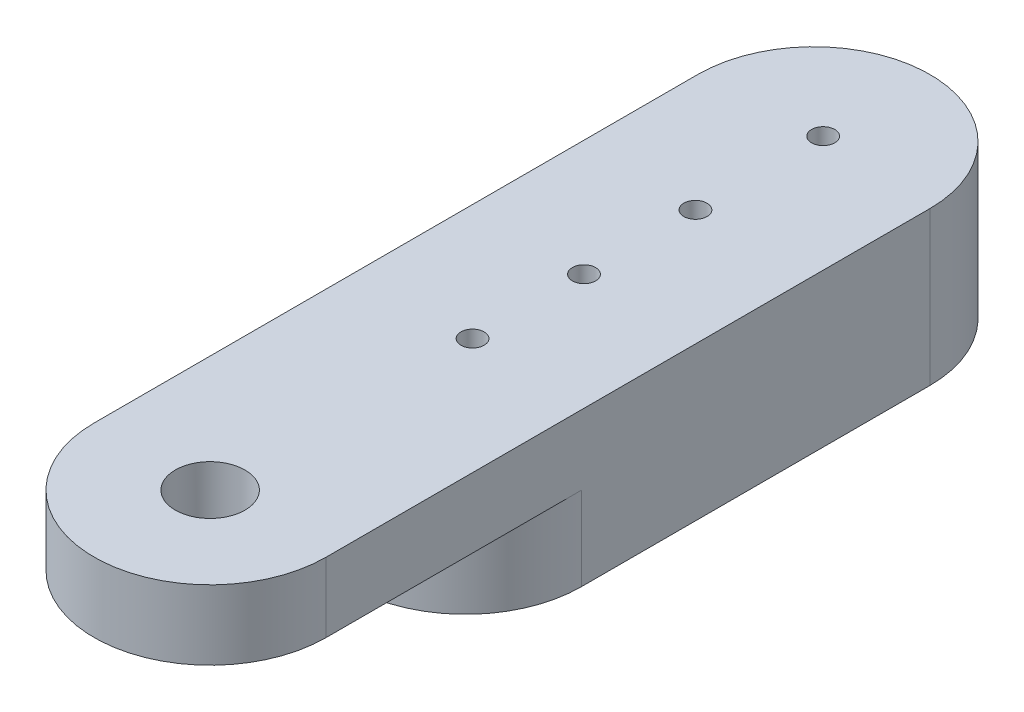
ISO-10303-21;
HEADER;
FILE_DESCRIPTION(('STEP AP214'),'2;1');
FILE_NAME('part.step','',(''),(''),'','','');
FILE_SCHEMA(('AUTOMOTIVE_DESIGN { 1 0 10303 214 1 1 1 1 }'));
ENDSEC;
DATA;
#1=APPLICATION_CONTEXT('core data for automotive mechanical design processes');
#2=APPLICATION_PROTOCOL_DEFINITION('international standard','automotive_design',2000,#1);
#3=PRODUCT_CONTEXT('',#1,'mechanical');
#4=PRODUCT('Part','Part','',(#3));
#5=PRODUCT_RELATED_PRODUCT_CATEGORY('part','',(#4));
#6=PRODUCT_DEFINITION_FORMATION('','',#4);
#7=PRODUCT_DEFINITION_CONTEXT('part definition',#1,'design');
#8=PRODUCT_DEFINITION('design','',#6,#7);
#9=PRODUCT_DEFINITION_SHAPE('','',#8);
#10=(LENGTH_UNIT() NAMED_UNIT(*) SI_UNIT(.MILLI.,.METRE.));
#11=(NAMED_UNIT(*) PLANE_ANGLE_UNIT() SI_UNIT($,.RADIAN.));
#12=(NAMED_UNIT(*) SI_UNIT($,.STERADIAN.) SOLID_ANGLE_UNIT());
#13=UNCERTAINTY_MEASURE_WITH_UNIT(LENGTH_MEASURE(1.E-05),#10,'distance_accuracy_value','');
#14=(GEOMETRIC_REPRESENTATION_CONTEXT(3) GLOBAL_UNCERTAINTY_ASSIGNED_CONTEXT((#13)) GLOBAL_UNIT_ASSIGNED_CONTEXT((#10,
#11,#12)) REPRESENTATION_CONTEXT('',''));
#15=CARTESIAN_POINT('',(0.,0.,0.));
#16=DIRECTION('',(0.,0.,1.));
#17=DIRECTION('',(1.,0.,0.));
#18=AXIS2_PLACEMENT_3D('',#15,#16,#17);
#19=CARTESIAN_POINT('',(0.,0.,2.3));
#20=DIRECTION('',(0.,1.,0.));
#21=DIRECTION('',(0.,0.,1.));
#22=AXIS2_PLACEMENT_3D('',#19,#20,#21);
#23=CYLINDRICAL_SURFACE('',#22,0.250000000000001);
#24=CARTESIAN_POINT('',(0.,0.,2.3));
#25=DIRECTION('',(0.,1.,0.));
#26=DIRECTION('',(0.,0.,1.));
#27=AXIS2_PLACEMENT_3D('',#24,#25,#26);
#28=CIRCLE('',#27,0.250000000000001);
#29=CARTESIAN_POINT('',(0.,0.,2.55));
#30=VERTEX_POINT('',#29);
#31=EDGE_CURVE('E151',#30,#30,#28,.T.);
#32=ORIENTED_EDGE('',*,*,#31,.F.);
#33=EDGE_LOOP('',(#32));
#34=FACE_BOUND('',#33,.T.);
#35=CARTESIAN_POINT('',(0.,3.3,2.3));
#36=DIRECTION('',(0.,-1.,0.));
#37=DIRECTION('',(0.,0.,-1.));
#38=AXIS2_PLACEMENT_3D('',#35,#36,#37);
#39=CIRCLE('',#38,0.250000000000001);
#40=CARTESIAN_POINT('',(0.,3.3,2.05));
#41=VERTEX_POINT('',#40);
#42=EDGE_CURVE('E154',#41,#41,#39,.T.);
#43=ORIENTED_EDGE('',*,*,#42,.F.);
#44=EDGE_LOOP('',(#43));
#45=FACE_BOUND('',#44,.T.);
#46=ADVANCED_FACE('F34',(#34,#45),#23,.F.);
#47=CARTESIAN_POINT('',(0.,0.,5.05));
#48=DIRECTION('',(0.,1.,0.));
#49=DIRECTION('',(0.,0.,1.));
#50=AXIS2_PLACEMENT_3D('',#47,#48,#49);
#51=CYLINDRICAL_SURFACE('',#50,0.250000000000001);
#52=CARTESIAN_POINT('',(0.,0.,5.05));
#53=DIRECTION('',(0.,1.,0.));
#54=DIRECTION('',(0.,0.,1.));
#55=AXIS2_PLACEMENT_3D('',#52,#53,#54);
#56=CIRCLE('',#55,0.250000000000001);
#57=CARTESIAN_POINT('',(0.,0.,5.3));
#58=VERTEX_POINT('',#57);
#59=EDGE_CURVE('E143',#58,#58,#56,.T.);
#60=ORIENTED_EDGE('',*,*,#59,.F.);
#61=EDGE_LOOP('',(#60));
#62=FACE_BOUND('',#61,.T.);
#63=CARTESIAN_POINT('',(0.,3.3,5.05));
#64=DIRECTION('',(0.,-1.,0.));
#65=DIRECTION('',(0.,0.,-1.));
#66=AXIS2_PLACEMENT_3D('',#63,#64,#65);
#67=CIRCLE('',#66,0.250000000000001);
#68=CARTESIAN_POINT('',(0.,3.3,4.8));
#69=VERTEX_POINT('',#68);
#70=EDGE_CURVE('E148',#69,#69,#67,.T.);
#71=ORIENTED_EDGE('',*,*,#70,.F.);
#72=EDGE_LOOP('',(#71));
#73=FACE_BOUND('',#72,.T.);
#74=ADVANCED_FACE('F218',(#62,#73),#51,.F.);
#75=CARTESIAN_POINT('',(0.,0.,7.45));
#76=DIRECTION('',(0.,1.,0.));
#77=DIRECTION('',(0.,0.,1.));
#78=AXIS2_PLACEMENT_3D('',#75,#76,#77);
#79=CYLINDRICAL_SURFACE('',#78,0.250000000000001);
#80=CARTESIAN_POINT('',(0.,0.,7.45));
#81=DIRECTION('',(0.,1.,0.));
#82=DIRECTION('',(0.,0.,1.));
#83=AXIS2_PLACEMENT_3D('',#80,#81,#82);
#84=CIRCLE('',#83,0.250000000000001);
#85=CARTESIAN_POINT('',(0.,0.,7.7));
#86=VERTEX_POINT('',#85);
#87=EDGE_CURVE('E137',#86,#86,#84,.T.);
#88=ORIENTED_EDGE('',*,*,#87,.F.);
#89=EDGE_LOOP('',(#88));
#90=FACE_BOUND('',#89,.T.);
#91=CARTESIAN_POINT('',(0.,3.3,7.45));
#92=DIRECTION('',(0.,-1.,0.));
#93=DIRECTION('',(0.,0.,-1.));
#94=AXIS2_PLACEMENT_3D('',#91,#92,#93);
#95=CIRCLE('',#94,0.250000000000001);
#96=CARTESIAN_POINT('',(0.,3.3,7.2));
#97=VERTEX_POINT('',#96);
#98=EDGE_CURVE('E139',#97,#97,#95,.T.);
#99=ORIENTED_EDGE('',*,*,#98,.F.);
#100=EDGE_LOOP('',(#99));
#101=FACE_BOUND('',#100,.T.);
#102=ADVANCED_FACE('F224',(#90,#101),#79,.F.);
#103=CARTESIAN_POINT('',(2.5,0.,0.));
#104=DIRECTION('',(-1.,0.,0.));
#105=DIRECTION('',(0.,0.,1.));
#106=AXIS2_PLACEMENT_3D('',#103,#104,#105);
#107=PLANE('',#106);
#108=DIRECTION('',(0.,0.,-1.));
#109=VECTOR('',#108,1.);
#110=CARTESIAN_POINT('',(2.5,1.8,12.5));
#111=LINE('',#110,#109);
#112=CARTESIAN_POINT('',(2.5,1.8,15.5));
#113=VERTEX_POINT('',#112);
#114=CARTESIAN_POINT('',(2.5,1.8,10.));
#115=VERTEX_POINT('',#114);
#116=EDGE_CURVE('E56',#113,#115,#111,.T.);
#117=ORIENTED_EDGE('',*,*,#116,.T.);
#118=DIRECTION('',(0.,-1.,0.));
#119=VECTOR('',#118,1.);
#120=CARTESIAN_POINT('',(2.5,0.,10.));
#121=LINE('',#120,#119);
#122=CARTESIAN_POINT('',(2.5,0.,9.99999999999999));
#123=VERTEX_POINT('',#122);
#124=EDGE_CURVE('E164',#115,#123,#121,.T.);
#125=ORIENTED_EDGE('',*,*,#124,.T.);
#126=DIRECTION('',(0.,0.,-1.));
#127=VECTOR('',#126,1.);
#128=CARTESIAN_POINT('',(2.5,0.,0.));
#129=LINE('',#128,#127);
#130=CARTESIAN_POINT('',(2.5,0.,2.5));
#131=VERTEX_POINT('',#130);
#132=EDGE_CURVE('E116',#123,#131,#129,.T.);
#133=ORIENTED_EDGE('',*,*,#132,.T.);
#134=DIRECTION('',(0.,1.,0.));
#135=VECTOR('',#134,1.);
#136=CARTESIAN_POINT('',(2.5,0.,2.5));
#137=LINE('',#136,#135);
#138=CARTESIAN_POINT('',(2.5,3.300006,2.5));
#139=VERTEX_POINT('',#138);
#140=EDGE_CURVE('E109',#131,#139,#137,.T.);
#141=ORIENTED_EDGE('',*,*,#140,.T.);
#142=DIRECTION('',(0.,0.,1.));
#143=VECTOR('',#142,1.);
#144=CARTESIAN_POINT('',(2.5,3.3,18.));
#145=LINE('',#144,#143);
#146=CARTESIAN_POINT('',(2.5,3.3,15.5));
#147=VERTEX_POINT('',#146);
#148=EDGE_CURVE('E97',#139,#147,#145,.T.);
#149=ORIENTED_EDGE('',*,*,#148,.T.);
#150=DIRECTION('',(0.,1.,0.));
#151=VECTOR('',#150,1.);
#152=CARTESIAN_POINT('',(2.5,0.,15.5));
#153=LINE('',#152,#151);
#154=EDGE_CURVE('E105',#113,#147,#153,.T.);
#155=ORIENTED_EDGE('',*,*,#154,.F.);
#156=EDGE_LOOP('',(#117,#125,#133,#141,#149,#155));
#157=FACE_BOUND('',#156,.T.);
#158=ADVANCED_FACE('F112',(#157),#107,.F.);
#159=CARTESIAN_POINT('',(-2.5,0.,0.));
#160=DIRECTION('',(-1.,0.,0.));
#161=DIRECTION('',(0.,0.,1.));
#162=AXIS2_PLACEMENT_3D('',#159,#160,#161);
#163=PLANE('',#162);
#164=DIRECTION('',(0.,0.,-1.));
#165=VECTOR('',#164,1.);
#166=CARTESIAN_POINT('',(-2.5,0.,0.));
#167=LINE('',#166,#165);
#168=CARTESIAN_POINT('',(-2.5,0.,9.99999999999999));
#169=VERTEX_POINT('',#168);
#170=CARTESIAN_POINT('',(-2.5,0.,2.5));
#171=VERTEX_POINT('',#170);
#172=EDGE_CURVE('E114',#169,#171,#167,.T.);
#173=ORIENTED_EDGE('',*,*,#172,.F.);
#174=DIRECTION('',(0.,-1.,0.));
#175=VECTOR('',#174,1.);
#176=CARTESIAN_POINT('',(-2.5,1.8,10.));
#177=LINE('',#176,#175);
#178=CARTESIAN_POINT('',(-2.5,1.8,10.));
#179=VERTEX_POINT('',#178);
#180=EDGE_CURVE('E161',#169,#179,#177,.F.);
#181=ORIENTED_EDGE('',*,*,#180,.T.);
#182=DIRECTION('',(0.,0.,-1.));
#183=VECTOR('',#182,1.);
#184=CARTESIAN_POINT('',(-2.5,1.8,12.5));
#185=LINE('',#184,#183);
#186=CARTESIAN_POINT('',(-2.5,1.8,15.5));
#187=VERTEX_POINT('',#186);
#188=EDGE_CURVE('E118',#187,#179,#185,.T.);
#189=ORIENTED_EDGE('',*,*,#188,.F.);
#190=DIRECTION('',(0.,1.,0.));
#191=VECTOR('',#190,1.);
#192=CARTESIAN_POINT('',(-2.5,0.,15.5));
#193=LINE('',#192,#191);
#194=CARTESIAN_POINT('',(-2.5,3.3,15.5));
#195=VERTEX_POINT('',#194);
#196=EDGE_CURVE('E133',#195,#187,#193,.F.);
#197=ORIENTED_EDGE('',*,*,#196,.F.);
#198=DIRECTION('',(0.,0.,1.));
#199=VECTOR('',#198,1.);
#200=CARTESIAN_POINT('',(-2.5,3.3,18.));
#201=LINE('',#200,#199);
#202=CARTESIAN_POINT('',(-2.5,3.3,2.5));
#203=VERTEX_POINT('',#202);
#204=EDGE_CURVE('E99',#203,#195,#201,.T.);
#205=ORIENTED_EDGE('',*,*,#204,.F.);
#206=DIRECTION('',(0.,1.,0.));
#207=VECTOR('',#206,1.);
#208=CARTESIAN_POINT('',(-2.5,0.,2.5));
#209=LINE('',#208,#207);
#210=EDGE_CURVE('E187',#171,#203,#209,.T.);
#211=ORIENTED_EDGE('',*,*,#210,.F.);
#212=EDGE_LOOP('',(#173,#181,#189,#197,#205,#211));
#213=FACE_BOUND('',#212,.T.);
#214=ADVANCED_FACE('F184',(#213),#163,.T.);
#215=CARTESIAN_POINT('',(2.5,3.3,18.));
#216=DIRECTION('',(0.,-1.,0.));
#217=DIRECTION('',(0.,0.,-1.));
#218=AXIS2_PLACEMENT_3D('',#215,#216,#217);
#219=PLANE('',#218);
#220=ORIENTED_EDGE('',*,*,#42,.T.);
#221=EDGE_LOOP('',(#220));
#222=FACE_BOUND('',#221,.T.);
#223=ORIENTED_EDGE('',*,*,#70,.T.);
#224=EDGE_LOOP('',(#223));
#225=FACE_BOUND('',#224,.T.);
#226=ORIENTED_EDGE('',*,*,#98,.T.);
#227=EDGE_LOOP('',(#226));
#228=FACE_BOUND('',#227,.T.);
#229=CARTESIAN_POINT('',(0.,3.3,9.85));
#230=DIRECTION('',(0.,-1.,0.));
#231=DIRECTION('',(0.,0.,-1.));
#232=AXIS2_PLACEMENT_3D('',#229,#230,#231);
#233=CIRCLE('',#232,0.250000000000001);
#234=CARTESIAN_POINT('',(0.,3.3,9.6));
#235=VERTEX_POINT('',#234);
#236=EDGE_CURVE('E340',#235,#235,#233,.T.);
#237=ORIENTED_EDGE('',*,*,#236,.T.);
#238=EDGE_LOOP('',(#237));
#239=FACE_BOUND('',#238,.T.);
#240=CARTESIAN_POINT('',(0.,3.3,15.5));
#241=DIRECTION('',(0.,-1.,0.));
#242=DIRECTION('',(0.,0.,-1.));
#243=AXIS2_PLACEMENT_3D('',#240,#241,#242);
#244=CIRCLE('',#243,0.750000000000001);
#245=CARTESIAN_POINT('',(0.,3.3,14.75));
#246=VERTEX_POINT('',#245);
#247=EDGE_CURVE('E129',#246,#246,#244,.T.);
#248=ORIENTED_EDGE('',*,*,#247,.T.);
#249=EDGE_LOOP('',(#248));
#250=FACE_BOUND('',#249,.T.);
#251=CARTESIAN_POINT('',(0.,3.3,2.5));
#252=DIRECTION('',(0.,-1.,0.));
#253=DIRECTION('',(0.,0.,-1.));
#254=AXIS2_PLACEMENT_3D('',#251,#252,#253);
#255=CIRCLE('',#254,2.5);
#256=EDGE_CURVE('E102',#139,#203,#255,.F.);
#257=ORIENTED_EDGE('',*,*,#256,.T.);
#258=ORIENTED_EDGE('',*,*,#204,.T.);
#259=CARTESIAN_POINT('',(0.,3.3,15.5));
#260=DIRECTION('',(0.,-1.,0.));
#261=DIRECTION('',(0.,0.,-1.));
#262=AXIS2_PLACEMENT_3D('',#259,#260,#261);
#263=CIRCLE('',#262,2.5);
#264=EDGE_CURVE('E93',#195,#147,#263,.F.);
#265=ORIENTED_EDGE('',*,*,#264,.T.);
#266=ORIENTED_EDGE('',*,*,#148,.F.);
#267=EDGE_LOOP('',(#257,#258,#265,#266));
#268=FACE_BOUND('',#267,.T.);
#269=ADVANCED_FACE('F95',(#222,#225,#228,#239,#250,#268),#219,.F.);
#270=CARTESIAN_POINT('',(2.5,1.8,12.5));
#271=DIRECTION('',(0.,1.,0.));
#272=DIRECTION('',(0.,0.,1.));
#273=AXIS2_PLACEMENT_3D('',#270,#271,#272);
#274=PLANE('',#273);
#275=CARTESIAN_POINT('',(0.,1.8,15.5));
#276=DIRECTION('',(0.,1.,0.));
#277=DIRECTION('',(0.,0.,1.));
#278=AXIS2_PLACEMENT_3D('',#275,#276,#277);
#279=CIRCLE('',#278,0.750000000000001);
#280=CARTESIAN_POINT('',(0.,1.8,16.25));
#281=VERTEX_POINT('',#280);
#282=EDGE_CURVE('E125',#281,#281,#279,.T.);
#283=ORIENTED_EDGE('',*,*,#282,.T.);
#284=EDGE_LOOP('',(#283));
#285=FACE_BOUND('',#284,.T.);
#286=ORIENTED_EDGE('',*,*,#116,.F.);
#287=CARTESIAN_POINT('',(0.,1.8,15.5));
#288=DIRECTION('',(0.,1.,0.));
#289=DIRECTION('',(0.,0.,1.));
#290=AXIS2_PLACEMENT_3D('',#287,#288,#289);
#291=CIRCLE('',#290,2.5);
#292=EDGE_CURVE('E103',#113,#187,#291,.F.);
#293=ORIENTED_EDGE('',*,*,#292,.T.);
#294=ORIENTED_EDGE('',*,*,#188,.T.);
#295=CARTESIAN_POINT('',(0.,1.8,10.));
#296=DIRECTION('',(0.,1.,0.));
#297=DIRECTION('',(0.,0.,1.));
#298=AXIS2_PLACEMENT_3D('',#295,#296,#297);
#299=CIRCLE('',#298,2.5);
#300=CARTESIAN_POINT('',(0.,1.8,12.5));
#301=VERTEX_POINT('',#300);
#302=EDGE_CURVE('E43',#179,#301,#299,.T.);
#303=ORIENTED_EDGE('',*,*,#302,.T.);
#304=CARTESIAN_POINT('',(0.,1.8,10.));
#305=DIRECTION('',(0.,1.,0.));
#306=DIRECTION('',(0.,0.,1.));
#307=AXIS2_PLACEMENT_3D('',#304,#305,#306);
#308=CIRCLE('',#307,2.5);
#309=EDGE_CURVE('E11',#301,#115,#308,.T.);
#310=ORIENTED_EDGE('',*,*,#309,.T.);
#311=EDGE_LOOP('',(#286,#293,#294,#303,#310));
#312=FACE_BOUND('',#311,.T.);
#313=ADVANCED_FACE('F204',(#285,#312),#274,.F.);
#314=CARTESIAN_POINT('',(2.5,0.,0.));
#315=DIRECTION('',(0.,1.,0.));
#316=DIRECTION('',(0.,0.,1.));
#317=AXIS2_PLACEMENT_3D('',#314,#315,#316);
#318=PLANE('',#317);
#319=ORIENTED_EDGE('',*,*,#31,.T.);
#320=EDGE_LOOP('',(#319));
#321=FACE_BOUND('',#320,.T.);
#322=ORIENTED_EDGE('',*,*,#59,.T.);
#323=EDGE_LOOP('',(#322));
#324=FACE_BOUND('',#323,.T.);
#325=ORIENTED_EDGE('',*,*,#87,.T.);
#326=EDGE_LOOP('',(#325));
#327=FACE_BOUND('',#326,.T.);
#328=CARTESIAN_POINT('',(0.,0.,9.85));
#329=DIRECTION('',(0.,1.,0.));
#330=DIRECTION('',(0.,0.,1.));
#331=AXIS2_PLACEMENT_3D('',#328,#329,#330);
#332=CIRCLE('',#331,0.250000000000001);
#333=CARTESIAN_POINT('',(0.,0.,10.1));
#334=VERTEX_POINT('',#333);
#335=EDGE_CURVE('E108',#334,#334,#332,.T.);
#336=ORIENTED_EDGE('',*,*,#335,.T.);
#337=EDGE_LOOP('',(#336));
#338=FACE_BOUND('',#337,.T.);
#339=CARTESIAN_POINT('',(0.,0.,10.));
#340=DIRECTION('',(0.,1.,0.));
#341=DIRECTION('',(0.,0.,1.));
#342=AXIS2_PLACEMENT_3D('',#339,#340,#341);
#343=CIRCLE('',#342,2.5);
#344=CARTESIAN_POINT('',(0.,0.,12.5));
#345=VERTEX_POINT('',#344);
#346=EDGE_CURVE('E157',#123,#345,#343,.F.);
#347=ORIENTED_EDGE('',*,*,#346,.T.);
#348=CARTESIAN_POINT('',(0.,0.,10.));
#349=DIRECTION('',(0.,1.,0.));
#350=DIRECTION('',(0.,0.,1.));
#351=AXIS2_PLACEMENT_3D('',#348,#349,#350);
#352=CIRCLE('',#351,2.5);
#353=EDGE_CURVE('E159',#345,#169,#352,.F.);
#354=ORIENTED_EDGE('',*,*,#353,.T.);
#355=ORIENTED_EDGE('',*,*,#172,.T.);
#356=CARTESIAN_POINT('',(0.,0.,2.5));
#357=DIRECTION('',(0.,-1.,0.));
#358=DIRECTION('',(0.,0.,1.));
#359=AXIS2_PLACEMENT_3D('',#356,#357,#358);
#360=CIRCLE('',#359,2.5);
#361=EDGE_CURVE('E175',#171,#131,#360,.T.);
#362=ORIENTED_EDGE('',*,*,#361,.T.);
#363=ORIENTED_EDGE('',*,*,#132,.F.);
#364=EDGE_LOOP('',(#347,#354,#355,#362,#363));
#365=FACE_BOUND('',#364,.T.);
#366=ADVANCED_FACE('F172',(#321,#324,#327,#338,#365),#318,.F.);
#367=CARTESIAN_POINT('',(0.,0.,15.5));
#368=DIRECTION('',(0.,1.,0.));
#369=DIRECTION('',(0.,0.,1.));
#370=AXIS2_PLACEMENT_3D('',#367,#368,#369);
#371=CYLINDRICAL_SURFACE('',#370,2.5);
#372=ORIENTED_EDGE('',*,*,#196,.T.);
#373=ORIENTED_EDGE('',*,*,#292,.F.);
#374=ORIENTED_EDGE('',*,*,#154,.T.);
#375=ORIENTED_EDGE('',*,*,#264,.F.);
#376=EDGE_LOOP('',(#372,#373,#374,#375));
#377=FACE_BOUND('',#376,.T.);
#378=ADVANCED_FACE('F106',(#377),#371,.T.);
#379=CARTESIAN_POINT('',(0.,0.,2.5));
#380=DIRECTION('',(0.,1.,0.));
#381=DIRECTION('',(0.,0.,1.));
#382=AXIS2_PLACEMENT_3D('',#379,#380,#381);
#383=CYLINDRICAL_SURFACE('',#382,2.5);
#384=ORIENTED_EDGE('',*,*,#256,.F.);
#385=ORIENTED_EDGE('',*,*,#140,.F.);
#386=ORIENTED_EDGE('',*,*,#361,.F.);
#387=ORIENTED_EDGE('',*,*,#210,.T.);
#388=EDGE_LOOP('',(#384,#385,#386,#387));
#389=FACE_BOUND('',#388,.T.);
#390=ADVANCED_FACE('F244',(#389),#383,.T.);
#391=CARTESIAN_POINT('',(0.,0.,9.85));
#392=DIRECTION('',(0.,1.,0.));
#393=DIRECTION('',(0.,0.,1.));
#394=AXIS2_PLACEMENT_3D('',#391,#392,#393);
#395=CYLINDRICAL_SURFACE('',#394,0.250000000000001);
#396=ORIENTED_EDGE('',*,*,#335,.F.);
#397=EDGE_LOOP('',(#396));
#398=FACE_BOUND('',#397,.T.);
#399=ORIENTED_EDGE('',*,*,#236,.F.);
#400=EDGE_LOOP('',(#399));
#401=FACE_BOUND('',#400,.T.);
#402=ADVANCED_FACE('F238',(#398,#401),#395,.F.);
#403=CARTESIAN_POINT('',(0.,0.,15.5));
#404=DIRECTION('',(0.,1.,0.));
#405=DIRECTION('',(0.,0.,1.));
#406=AXIS2_PLACEMENT_3D('',#403,#404,#405);
#407=CYLINDRICAL_SURFACE('',#406,0.750000000000001);
#408=ORIENTED_EDGE('',*,*,#282,.F.);
#409=EDGE_LOOP('',(#408));
#410=FACE_BOUND('',#409,.T.);
#411=ORIENTED_EDGE('',*,*,#247,.F.);
#412=EDGE_LOOP('',(#411));
#413=FACE_BOUND('',#412,.T.);
#414=ADVANCED_FACE('F234',(#410,#413),#407,.F.);
#415=CARTESIAN_POINT('',(0.,0.,10.));
#416=DIRECTION('',(0.,-1.,0.));
#417=DIRECTION('',(0.,0.,-1.));
#418=AXIS2_PLACEMENT_3D('',#415,#416,#417);
#419=CYLINDRICAL_SURFACE('',#418,2.5);
#420=ORIENTED_EDGE('',*,*,#124,.F.);
#421=ORIENTED_EDGE('',*,*,#309,.F.);
#422=DIRECTION('',(0.,-1.,0.));
#423=VECTOR('',#422,1.);
#424=CARTESIAN_POINT('',(0.,0.,12.5));
#425=LINE('',#424,#423);
#426=EDGE_CURVE('E38',#345,#301,#425,.F.);
#427=ORIENTED_EDGE('',*,*,#426,.F.);
#428=ORIENTED_EDGE('',*,*,#346,.F.);
#429=EDGE_LOOP('',(#420,#421,#427,#428));
#430=FACE_BOUND('',#429,.T.);
#431=ADVANCED_FACE('F36',(#430),#419,.T.);
#432=CARTESIAN_POINT('',(0.,0.,10.));
#433=DIRECTION('',(0.,1.,0.));
#434=DIRECTION('',(0.,0.,1.));
#435=AXIS2_PLACEMENT_3D('',#432,#433,#434);
#436=CYLINDRICAL_SURFACE('',#435,2.5);
#437=ORIENTED_EDGE('',*,*,#302,.F.);
#438=ORIENTED_EDGE('',*,*,#180,.F.);
#439=ORIENTED_EDGE('',*,*,#353,.F.);
#440=ORIENTED_EDGE('',*,*,#426,.T.);
#441=EDGE_LOOP('',(#437,#438,#439,#440));
#442=FACE_BOUND('',#441,.T.);
#443=ADVANCED_FACE('F180',(#442),#436,.T.);
#444=CLOSED_SHELL('',(#46,#74,#102,#158,#214,#269,#313,#366,#378,#390,#402,#414,#431,#443));
#445=MANIFOLD_SOLID_BREP('B2',#444);
#446=ADVANCED_BREP_SHAPE_REPRESENTATION('',(#18,#445),#14);
#447=SHAPE_DEFINITION_REPRESENTATION(#9,#446);
ENDSEC;
END-ISO-10303-21;
